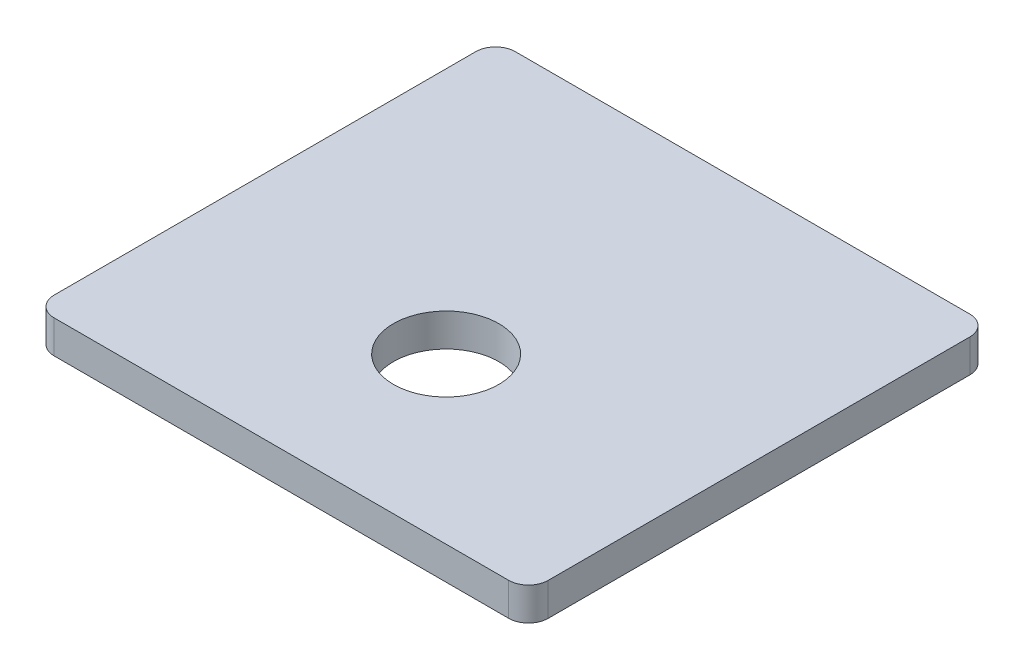
ISO-10303-21;
HEADER;
FILE_DESCRIPTION(('STEP AP214'),'2;1');
FILE_NAME('part.step','',(''),(''),'','','');
FILE_SCHEMA(('AUTOMOTIVE_DESIGN { 1 0 10303 214 1 1 1 1 }'));
ENDSEC;
DATA;
#1=APPLICATION_CONTEXT('core data for automotive mechanical design processes');
#2=APPLICATION_PROTOCOL_DEFINITION('international standard','automotive_design',2000,#1);
#3=PRODUCT_CONTEXT('',#1,'mechanical');
#4=PRODUCT('Part','Part','',(#3));
#5=PRODUCT_RELATED_PRODUCT_CATEGORY('part','',(#4));
#6=PRODUCT_DEFINITION_FORMATION('','',#4);
#7=PRODUCT_DEFINITION_CONTEXT('part definition',#1,'design');
#8=PRODUCT_DEFINITION('design','',#6,#7);
#9=PRODUCT_DEFINITION_SHAPE('','',#8);
#10=(LENGTH_UNIT() NAMED_UNIT(*) SI_UNIT(.MILLI.,.METRE.));
#11=(NAMED_UNIT(*) PLANE_ANGLE_UNIT() SI_UNIT($,.RADIAN.));
#12=(NAMED_UNIT(*) SI_UNIT($,.STERADIAN.) SOLID_ANGLE_UNIT());
#13=UNCERTAINTY_MEASURE_WITH_UNIT(LENGTH_MEASURE(1.E-05),#10,'distance_accuracy_value','');
#14=(GEOMETRIC_REPRESENTATION_CONTEXT(3) GLOBAL_UNCERTAINTY_ASSIGNED_CONTEXT((#13)) GLOBAL_UNIT_ASSIGNED_CONTEXT((#10,
#11,#12)) REPRESENTATION_CONTEXT('',''));
#15=CARTESIAN_POINT('',(0.,0.,0.));
#16=DIRECTION('',(0.,0.,1.));
#17=DIRECTION('',(1.,0.,0.));
#18=AXIS2_PLACEMENT_3D('',#15,#16,#17);
#19=CARTESIAN_POINT('',(0.,5.,70.));
#20=DIRECTION('',(1.,0.,0.));
#21=DIRECTION('',(0.,0.,-1.));
#22=AXIS2_PLACEMENT_3D('',#19,#20,#21);
#23=PLANE('',#22);
#24=DIRECTION('',(0.,0.,-1.));
#25=VECTOR('',#24,1.);
#26=CARTESIAN_POINT('',(0.,5.,70.));
#27=LINE('',#26,#25);
#28=CARTESIAN_POINT('',(0.,5.,67.));
#29=VERTEX_POINT('',#28);
#30=CARTESIAN_POINT('',(0.,5.,3.));
#31=VERTEX_POINT('',#30);
#32=EDGE_CURVE('E160',#29,#31,#27,.T.);
#33=ORIENTED_EDGE('',*,*,#32,.T.);
#34=DIRECTION('',(0.,-1.,0.));
#35=VECTOR('',#34,1.);
#36=CARTESIAN_POINT('',(0.,5.,3.));
#37=LINE('',#36,#35);
#38=CARTESIAN_POINT('',(0.,0.,3.));
#39=VERTEX_POINT('',#38);
#40=EDGE_CURVE('E124',#31,#39,#37,.T.);
#41=ORIENTED_EDGE('',*,*,#40,.T.);
#42=DIRECTION('',(0.,0.,-1.));
#43=VECTOR('',#42,1.);
#44=CARTESIAN_POINT('',(0.,0.,70.));
#45=LINE('',#44,#43);
#46=CARTESIAN_POINT('',(0.,0.,67.));
#47=VERTEX_POINT('',#46);
#48=EDGE_CURVE('E109',#47,#39,#45,.T.);
#49=ORIENTED_EDGE('',*,*,#48,.F.);
#50=DIRECTION('',(0.,-1.,0.));
#51=VECTOR('',#50,1.);
#52=CARTESIAN_POINT('',(0.,5.,67.));
#53=LINE('',#52,#51);
#54=EDGE_CURVE('E121',#47,#29,#53,.F.);
#55=ORIENTED_EDGE('',*,*,#54,.T.);
#56=EDGE_LOOP('',(#33,#41,#49,#55));
#57=FACE_BOUND('',#56,.T.);
#58=ADVANCED_FACE('F39',(#57),#23,.F.);
#59=CARTESIAN_POINT('',(0.,0.,70.));
#60=DIRECTION('',(0.,1.,0.));
#61=DIRECTION('',(0.,0.,1.));
#62=AXIS2_PLACEMENT_3D('',#59,#60,#61);
#63=PLANE('',#62);
#64=CARTESIAN_POINT('',(37.5,0.,45.));
#65=DIRECTION('',(0.,1.,0.));
#66=DIRECTION('',(0.,0.,1.));
#67=AXIS2_PLACEMENT_3D('',#64,#65,#66);
#68=CIRCLE('',#67,8.);
#69=CARTESIAN_POINT('',(37.5,0.,53.));
#70=VERTEX_POINT('',#69);
#71=EDGE_CURVE('E171',#70,#70,#68,.T.);
#72=ORIENTED_EDGE('',*,*,#71,.T.);
#73=EDGE_LOOP('',(#72));
#74=FACE_BOUND('',#73,.T.);
#75=ORIENTED_EDGE('',*,*,#48,.T.);
#76=CARTESIAN_POINT('',(3.,0.,3.));
#77=DIRECTION('',(0.,1.,0.));
#78=DIRECTION('',(0.,0.,1.));
#79=AXIS2_PLACEMENT_3D('',#76,#77,#78);
#80=CIRCLE('',#79,3.);
#81=CARTESIAN_POINT('',(3.,0.,0.));
#82=VERTEX_POINT('',#81);
#83=EDGE_CURVE('E136',#39,#82,#80,.F.);
#84=ORIENTED_EDGE('',*,*,#83,.T.);
#85=DIRECTION('',(1.,0.,0.));
#86=VECTOR('',#85,1.);
#87=CARTESIAN_POINT('',(0.,0.,0.));
#88=LINE('',#87,#86);
#89=CARTESIAN_POINT('',(72.,0.,0.));
#90=VERTEX_POINT('',#89);
#91=EDGE_CURVE('E168',#82,#90,#88,.T.);
#92=ORIENTED_EDGE('',*,*,#91,.T.);
#93=CARTESIAN_POINT('',(72.,0.,3.));
#94=DIRECTION('',(0.,1.,0.));
#95=DIRECTION('',(0.,0.,1.));
#96=AXIS2_PLACEMENT_3D('',#93,#94,#95);
#97=CIRCLE('',#96,3.);
#98=CARTESIAN_POINT('',(75.,0.,3.));
#99=VERTEX_POINT('',#98);
#100=EDGE_CURVE('E115',#90,#99,#97,.F.);
#101=ORIENTED_EDGE('',*,*,#100,.T.);
#102=DIRECTION('',(0.,0.,-1.));
#103=VECTOR('',#102,1.);
#104=CARTESIAN_POINT('',(75.,0.,70.));
#105=LINE('',#104,#103);
#106=CARTESIAN_POINT('',(75.,0.,67.));
#107=VERTEX_POINT('',#106);
#108=EDGE_CURVE('E125',#107,#99,#105,.T.);
#109=ORIENTED_EDGE('',*,*,#108,.F.);
#110=CARTESIAN_POINT('',(72.,0.,67.));
#111=DIRECTION('',(0.,1.,0.));
#112=DIRECTION('',(0.,0.,1.));
#113=AXIS2_PLACEMENT_3D('',#110,#111,#112);
#114=CIRCLE('',#113,3.);
#115=CARTESIAN_POINT('',(72.,0.,70.));
#116=VERTEX_POINT('',#115);
#117=EDGE_CURVE('E116',#107,#116,#114,.F.);
#118=ORIENTED_EDGE('',*,*,#117,.T.);
#119=DIRECTION('',(1.,0.,0.));
#120=VECTOR('',#119,1.);
#121=CARTESIAN_POINT('',(0.,0.,70.));
#122=LINE('',#121,#120);
#123=CARTESIAN_POINT('',(3.,0.,70.));
#124=VERTEX_POINT('',#123);
#125=EDGE_CURVE('E111',#124,#116,#122,.T.);
#126=ORIENTED_EDGE('',*,*,#125,.F.);
#127=CARTESIAN_POINT('',(3.,0.,67.));
#128=DIRECTION('',(0.,1.,0.));
#129=DIRECTION('',(0.,0.,1.));
#130=AXIS2_PLACEMENT_3D('',#127,#128,#129);
#131=CIRCLE('',#130,3.);
#132=EDGE_CURVE('E106',#124,#47,#131,.F.);
#133=ORIENTED_EDGE('',*,*,#132,.T.);
#134=EDGE_LOOP('',(#75,#84,#92,#101,#109,#118,#126,#133));
#135=FACE_BOUND('',#134,.T.);
#136=ADVANCED_FACE('F108',(#74,#135),#63,.F.);
#137=CARTESIAN_POINT('',(75.,0.,70.));
#138=DIRECTION('',(-1.,0.,0.));
#139=DIRECTION('',(0.,0.,1.));
#140=AXIS2_PLACEMENT_3D('',#137,#138,#139);
#141=PLANE('',#140);
#142=ORIENTED_EDGE('',*,*,#108,.T.);
#143=DIRECTION('',(0.,1.,0.));
#144=VECTOR('',#143,1.);
#145=CARTESIAN_POINT('',(75.,0.,3.));
#146=LINE('',#145,#144);
#147=CARTESIAN_POINT('',(75.,5.,3.));
#148=VERTEX_POINT('',#147);
#149=EDGE_CURVE('E149',#99,#148,#146,.T.);
#150=ORIENTED_EDGE('',*,*,#149,.T.);
#151=DIRECTION('',(0.,0.,-1.));
#152=VECTOR('',#151,1.);
#153=CARTESIAN_POINT('',(75.,5.,70.));
#154=LINE('',#153,#152);
#155=CARTESIAN_POINT('',(75.,5.,67.));
#156=VERTEX_POINT('',#155);
#157=EDGE_CURVE('E162',#156,#148,#154,.T.);
#158=ORIENTED_EDGE('',*,*,#157,.F.);
#159=DIRECTION('',(0.,1.,0.));
#160=VECTOR('',#159,1.);
#161=CARTESIAN_POINT('',(75.,0.,67.));
#162=LINE('',#161,#160);
#163=EDGE_CURVE('E147',#156,#107,#162,.F.);
#164=ORIENTED_EDGE('',*,*,#163,.T.);
#165=EDGE_LOOP('',(#142,#150,#158,#164));
#166=FACE_BOUND('',#165,.T.);
#167=ADVANCED_FACE('F176',(#166),#141,.F.);
#168=CARTESIAN_POINT('',(75.,5.,70.));
#169=DIRECTION('',(0.,-1.,0.));
#170=DIRECTION('',(0.,0.,-1.));
#171=AXIS2_PLACEMENT_3D('',#168,#169,#170);
#172=PLANE('',#171);
#173=CARTESIAN_POINT('',(37.5,5.,45.));
#174=DIRECTION('',(0.,1.,0.));
#175=DIRECTION('',(0.,0.,1.));
#176=AXIS2_PLACEMENT_3D('',#173,#174,#175);
#177=CIRCLE('',#176,8.);
#178=CARTESIAN_POINT('',(37.5,5.,53.));
#179=VERTEX_POINT('',#178);
#180=EDGE_CURVE('E302',#179,#179,#177,.T.);
#181=ORIENTED_EDGE('',*,*,#180,.F.);
#182=EDGE_LOOP('',(#181));
#183=FACE_BOUND('',#182,.T.);
#184=DIRECTION('',(-1.,0.,0.));
#185=VECTOR('',#184,1.);
#186=CARTESIAN_POINT('',(75.,5.,0.));
#187=LINE('',#186,#185);
#188=CARTESIAN_POINT('',(72.,5.,0.));
#189=VERTEX_POINT('',#188);
#190=CARTESIAN_POINT('',(3.,5.,0.));
#191=VERTEX_POINT('',#190);
#192=EDGE_CURVE('E164',#189,#191,#187,.T.);
#193=ORIENTED_EDGE('',*,*,#192,.T.);
#194=CARTESIAN_POINT('',(3.,5.,3.));
#195=DIRECTION('',(0.,-1.,0.));
#196=DIRECTION('',(0.,0.,-1.));
#197=AXIS2_PLACEMENT_3D('',#194,#195,#196);
#198=CIRCLE('',#197,3.);
#199=EDGE_CURVE('E145',#191,#31,#198,.F.);
#200=ORIENTED_EDGE('',*,*,#199,.T.);
#201=ORIENTED_EDGE('',*,*,#32,.F.);
#202=CARTESIAN_POINT('',(3.,5.,67.));
#203=DIRECTION('',(0.,-1.,0.));
#204=DIRECTION('',(0.,0.,-1.));
#205=AXIS2_PLACEMENT_3D('',#202,#203,#204);
#206=CIRCLE('',#205,3.);
#207=CARTESIAN_POINT('',(3.,5.,70.));
#208=VERTEX_POINT('',#207);
#209=EDGE_CURVE('E129',#29,#208,#206,.F.);
#210=ORIENTED_EDGE('',*,*,#209,.T.);
#211=DIRECTION('',(-1.,0.,0.));
#212=VECTOR('',#211,1.);
#213=CARTESIAN_POINT('',(75.,5.,70.));
#214=LINE('',#213,#212);
#215=CARTESIAN_POINT('',(72.,5.,70.));
#216=VERTEX_POINT('',#215);
#217=EDGE_CURVE('E155',#216,#208,#214,.T.);
#218=ORIENTED_EDGE('',*,*,#217,.F.);
#219=CARTESIAN_POINT('',(72.,5.,67.));
#220=DIRECTION('',(0.,-1.,0.));
#221=DIRECTION('',(0.,0.,-1.));
#222=AXIS2_PLACEMENT_3D('',#219,#220,#221);
#223=CIRCLE('',#222,3.);
#224=EDGE_CURVE('E62',#216,#156,#223,.F.);
#225=ORIENTED_EDGE('',*,*,#224,.T.);
#226=ORIENTED_EDGE('',*,*,#157,.T.);
#227=CARTESIAN_POINT('',(72.,5.,3.));
#228=DIRECTION('',(0.,-1.,0.));
#229=DIRECTION('',(0.,0.,-1.));
#230=AXIS2_PLACEMENT_3D('',#227,#228,#229);
#231=CIRCLE('',#230,3.);
#232=EDGE_CURVE('E54',#148,#189,#231,.F.);
#233=ORIENTED_EDGE('',*,*,#232,.T.);
#234=EDGE_LOOP('',(#193,#200,#201,#210,#218,#225,#226,#233));
#235=FACE_BOUND('',#234,.T.);
#236=ADVANCED_FACE('F159',(#183,#235),#172,.F.);
#237=CARTESIAN_POINT('',(0.,0.,70.));
#238=DIRECTION('',(0.,0.,1.));
#239=DIRECTION('',(1.,0.,0.));
#240=AXIS2_PLACEMENT_3D('',#237,#238,#239);
#241=PLANE('',#240);
#242=ORIENTED_EDGE('',*,*,#217,.T.);
#243=DIRECTION('',(0.,-1.,0.));
#244=VECTOR('',#243,1.);
#245=CARTESIAN_POINT('',(3.,0.,70.));
#246=LINE('',#245,#244);
#247=EDGE_CURVE('E11',#208,#124,#246,.T.);
#248=ORIENTED_EDGE('',*,*,#247,.T.);
#249=ORIENTED_EDGE('',*,*,#125,.T.);
#250=DIRECTION('',(0.,1.,0.));
#251=VECTOR('',#250,1.);
#252=CARTESIAN_POINT('',(72.,5.,70.));
#253=LINE('',#252,#251);
#254=EDGE_CURVE('E47',#116,#216,#253,.T.);
#255=ORIENTED_EDGE('',*,*,#254,.T.);
#256=EDGE_LOOP('',(#242,#248,#249,#255));
#257=FACE_BOUND('',#256,.T.);
#258=ADVANCED_FACE('F154',(#257),#241,.T.);
#259=CARTESIAN_POINT('',(0.,0.,0.));
#260=DIRECTION('',(0.,0.,1.));
#261=DIRECTION('',(1.,0.,0.));
#262=AXIS2_PLACEMENT_3D('',#259,#260,#261);
#263=PLANE('',#262);
#264=ORIENTED_EDGE('',*,*,#91,.F.);
#265=DIRECTION('',(0.,-1.,0.));
#266=VECTOR('',#265,1.);
#267=CARTESIAN_POINT('',(3.,0.,0.));
#268=LINE('',#267,#266);
#269=EDGE_CURVE('E140',#82,#191,#268,.F.);
#270=ORIENTED_EDGE('',*,*,#269,.T.);
#271=ORIENTED_EDGE('',*,*,#192,.F.);
#272=DIRECTION('',(0.,1.,0.));
#273=VECTOR('',#272,1.);
#274=CARTESIAN_POINT('',(72.,0.,0.));
#275=LINE('',#274,#273);
#276=EDGE_CURVE('E138',#189,#90,#275,.F.);
#277=ORIENTED_EDGE('',*,*,#276,.T.);
#278=EDGE_LOOP('',(#264,#270,#271,#277));
#279=FACE_BOUND('',#278,.T.);
#280=ADVANCED_FACE('F183',(#279),#263,.F.);
#281=CARTESIAN_POINT('',(3.,5.,3.));
#282=DIRECTION('',(0.,-1.,0.));
#283=DIRECTION('',(0.,0.,-1.));
#284=AXIS2_PLACEMENT_3D('',#281,#282,#283);
#285=CYLINDRICAL_SURFACE('',#284,3.);
#286=ORIENTED_EDGE('',*,*,#199,.F.);
#287=ORIENTED_EDGE('',*,*,#269,.F.);
#288=ORIENTED_EDGE('',*,*,#83,.F.);
#289=ORIENTED_EDGE('',*,*,#40,.F.);
#290=EDGE_LOOP('',(#286,#287,#288,#289));
#291=FACE_BOUND('',#290,.T.);
#292=ADVANCED_FACE('F187',(#291),#285,.T.);
#293=CARTESIAN_POINT('',(72.,0.,3.));
#294=DIRECTION('',(0.,1.,0.));
#295=DIRECTION('',(0.,0.,1.));
#296=AXIS2_PLACEMENT_3D('',#293,#294,#295);
#297=CYLINDRICAL_SURFACE('',#296,3.);
#298=ORIENTED_EDGE('',*,*,#100,.F.);
#299=ORIENTED_EDGE('',*,*,#276,.F.);
#300=ORIENTED_EDGE('',*,*,#232,.F.);
#301=ORIENTED_EDGE('',*,*,#149,.F.);
#302=EDGE_LOOP('',(#298,#299,#300,#301));
#303=FACE_BOUND('',#302,.T.);
#304=ADVANCED_FACE('F179',(#303),#297,.T.);
#305=CARTESIAN_POINT('',(3.,0.,67.));
#306=DIRECTION('',(0.,1.,0.));
#307=DIRECTION('',(0.,0.,1.));
#308=AXIS2_PLACEMENT_3D('',#305,#306,#307);
#309=CYLINDRICAL_SURFACE('',#308,3.);
#310=ORIENTED_EDGE('',*,*,#209,.F.);
#311=ORIENTED_EDGE('',*,*,#54,.F.);
#312=ORIENTED_EDGE('',*,*,#132,.F.);
#313=ORIENTED_EDGE('',*,*,#247,.F.);
#314=EDGE_LOOP('',(#310,#311,#312,#313));
#315=FACE_BOUND('',#314,.T.);
#316=ADVANCED_FACE('F128',(#315),#309,.T.);
#317=CARTESIAN_POINT('',(72.,0.,67.));
#318=DIRECTION('',(0.,-1.,0.));
#319=DIRECTION('',(0.,0.,-1.));
#320=AXIS2_PLACEMENT_3D('',#317,#318,#319);
#321=CYLINDRICAL_SURFACE('',#320,3.);
#322=ORIENTED_EDGE('',*,*,#117,.F.);
#323=ORIENTED_EDGE('',*,*,#163,.F.);
#324=ORIENTED_EDGE('',*,*,#224,.F.);
#325=ORIENTED_EDGE('',*,*,#254,.F.);
#326=EDGE_LOOP('',(#322,#323,#324,#325));
#327=FACE_BOUND('',#326,.T.);
#328=ADVANCED_FACE('F41',(#327),#321,.T.);
#329=CARTESIAN_POINT('',(37.5,0.,45.));
#330=DIRECTION('',(0.,1.,0.));
#331=DIRECTION('',(0.,0.,1.));
#332=AXIS2_PLACEMENT_3D('',#329,#330,#331);
#333=CYLINDRICAL_SURFACE('',#332,8.);
#334=ORIENTED_EDGE('',*,*,#71,.F.);
#335=EDGE_LOOP('',(#334));
#336=FACE_BOUND('',#335,.T.);
#337=ORIENTED_EDGE('',*,*,#180,.T.);
#338=EDGE_LOOP('',(#337));
#339=FACE_BOUND('',#338,.T.);
#340=ADVANCED_FACE('F189',(#336,#339),#333,.F.);
#341=CLOSED_SHELL('',(#58,#136,#167,#236,#258,#280,#292,#304,#316,#328,#340));
#342=MANIFOLD_SOLID_BREP('B2',#341);
#343=ADVANCED_BREP_SHAPE_REPRESENTATION('',(#18,#342),#14);
#344=SHAPE_DEFINITION_REPRESENTATION(#9,#343);
ENDSEC;
END-ISO-10303-21;
